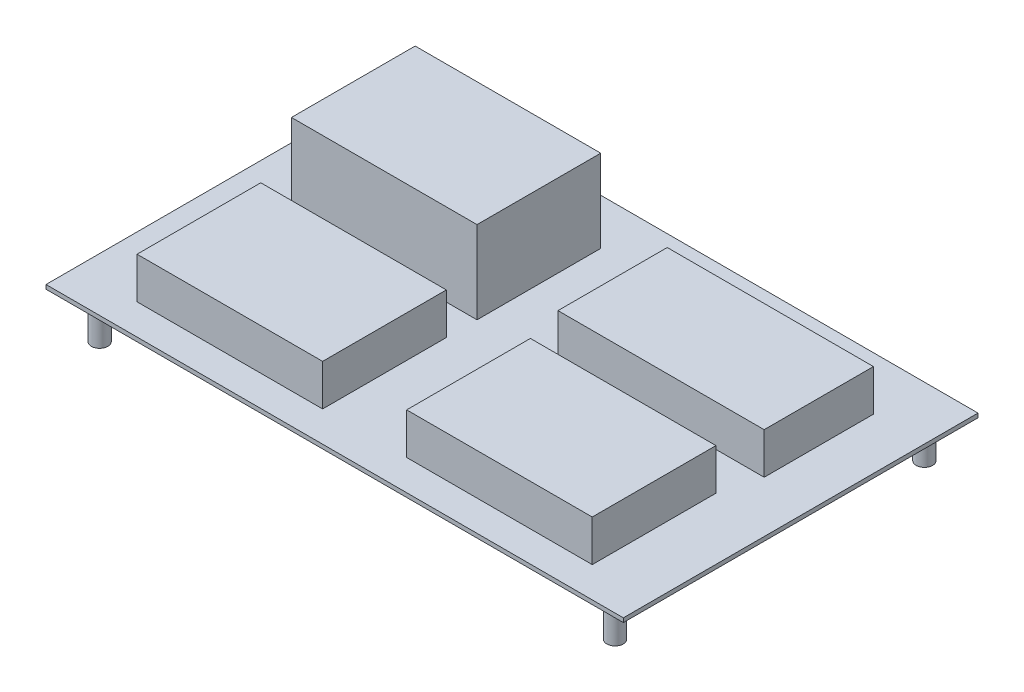
ISO-10303-21;
HEADER;
FILE_DESCRIPTION(('STEP AP214'),'2;1');
FILE_NAME('part.step','',(''),(''),'','','');
FILE_SCHEMA(('AUTOMOTIVE_DESIGN { 1 0 10303 214 1 1 1 1 }'));
ENDSEC;
DATA;
#1=APPLICATION_CONTEXT('core data for automotive mechanical design processes');
#2=APPLICATION_PROTOCOL_DEFINITION('international standard','automotive_design',2000,#1);
#3=PRODUCT_CONTEXT('',#1,'mechanical');
#4=PRODUCT('Part','Part','',(#3));
#5=PRODUCT_RELATED_PRODUCT_CATEGORY('part','',(#4));
#6=PRODUCT_DEFINITION_FORMATION('','',#4);
#7=PRODUCT_DEFINITION_CONTEXT('part definition',#1,'design');
#8=PRODUCT_DEFINITION('design','',#6,#7);
#9=PRODUCT_DEFINITION_SHAPE('','',#8);
#10=(LENGTH_UNIT() NAMED_UNIT(*) SI_UNIT(.MILLI.,.METRE.));
#11=(NAMED_UNIT(*) PLANE_ANGLE_UNIT() SI_UNIT($,.RADIAN.));
#12=(NAMED_UNIT(*) SI_UNIT($,.STERADIAN.) SOLID_ANGLE_UNIT());
#13=UNCERTAINTY_MEASURE_WITH_UNIT(LENGTH_MEASURE(1.E-05),#10,'distance_accuracy_value','');
#14=(GEOMETRIC_REPRESENTATION_CONTEXT(3) GLOBAL_UNCERTAINTY_ASSIGNED_CONTEXT((#13)) GLOBAL_UNIT_ASSIGNED_CONTEXT((#10,
#11,#12)) REPRESENTATION_CONTEXT('',''));
#15=CARTESIAN_POINT('',(0.,0.,0.));
#16=DIRECTION('',(0.,0.,1.));
#17=DIRECTION('',(1.,0.,0.));
#18=AXIS2_PLACEMENT_3D('',#15,#16,#17);
#19=CARTESIAN_POINT('',(0.,2.,0.));
#20=DIRECTION('',(0.,-1.,0.));
#21=DIRECTION('',(0.,0.,-1.));
#22=AXIS2_PLACEMENT_3D('',#19,#20,#21);
#23=PLANE('',#22);
#24=DIRECTION('',(0.,0.,-1.));
#25=VECTOR('',#24,1.);
#26=CARTESIAN_POINT('',(110.116180531911,2.,71.2018310445277));
#27=LINE('',#26,#25);
#28=CARTESIAN_POINT('',(110.116180531911,2.,71.2018310445277));
#29=VERTEX_POINT('',#28);
#30=CARTESIAN_POINT('',(110.116180531911,2.,11.2018310445277));
#31=VERTEX_POINT('',#30);
#32=EDGE_CURVE('E263',#29,#31,#27,.T.);
#33=ORIENTED_EDGE('',*,*,#32,.F.);
#34=DIRECTION('',(1.,0.,0.));
#35=VECTOR('',#34,1.);
#36=CARTESIAN_POINT('',(20.1161805319109,2.,71.2018310445277));
#37=LINE('',#36,#35);
#38=CARTESIAN_POINT('',(20.1161805319109,2.,71.2018310445277));
#39=VERTEX_POINT('',#38);
#40=EDGE_CURVE('E253',#39,#29,#37,.T.);
#41=ORIENTED_EDGE('',*,*,#40,.F.);
#42=DIRECTION('',(0.,0.,1.));
#43=VECTOR('',#42,1.);
#44=CARTESIAN_POINT('',(20.1161805319109,2.,71.2018310445277));
#45=LINE('',#44,#43);
#46=CARTESIAN_POINT('',(20.1161805319109,2.,11.2018310445277));
#47=VERTEX_POINT('',#46);
#48=EDGE_CURVE('E256',#47,#39,#45,.T.);
#49=ORIENTED_EDGE('',*,*,#48,.F.);
#50=DIRECTION('',(-1.,0.,0.));
#51=VECTOR('',#50,1.);
#52=CARTESIAN_POINT('',(20.1161805319109,2.,11.2018310445277));
#53=LINE('',#52,#51);
#54=EDGE_CURVE('E260',#31,#47,#53,.T.);
#55=ORIENTED_EDGE('',*,*,#54,.F.);
#56=EDGE_LOOP('',(#33,#41,#49,#55));
#57=FACE_BOUND('',#56,.T.);
#58=DIRECTION('',(0.,0.,-1.));
#59=VECTOR('',#58,1.);
#60=CARTESIAN_POINT('',(-20.6398819657247,2.,-3.67555706881552));
#61=LINE('',#60,#59);
#62=CARTESIAN_POINT('',(-20.6398819657247,2.,-3.67555706881552));
#63=VERTEX_POINT('',#62);
#64=CARTESIAN_POINT('',(-20.6398819657247,2.,-63.6755570688155));
#65=VERTEX_POINT('',#64);
#66=EDGE_CURVE('E299',#63,#65,#61,.T.);
#67=ORIENTED_EDGE('',*,*,#66,.F.);
#68=DIRECTION('',(1.,0.,0.));
#69=VECTOR('',#68,1.);
#70=CARTESIAN_POINT('',(-110.639881965725,2.,-3.67555706881552));
#71=LINE('',#70,#69);
#72=CARTESIAN_POINT('',(-110.639881965725,2.,-3.67555706881552));
#73=VERTEX_POINT('',#72);
#74=EDGE_CURVE('E313',#73,#63,#71,.T.);
#75=ORIENTED_EDGE('',*,*,#74,.F.);
#76=DIRECTION('',(0.,0.,1.));
#77=VECTOR('',#76,1.);
#78=CARTESIAN_POINT('',(-110.639881965725,2.,-3.67555706881552));
#79=LINE('',#78,#77);
#80=CARTESIAN_POINT('',(-110.639881965725,2.,-63.6755570688155));
#81=VERTEX_POINT('',#80);
#82=EDGE_CURVE('E184',#81,#73,#79,.T.);
#83=ORIENTED_EDGE('',*,*,#82,.F.);
#84=DIRECTION('',(-1.,0.,0.));
#85=VECTOR('',#84,1.);
#86=CARTESIAN_POINT('',(-110.639881965725,2.,-63.6755570688155));
#87=LINE('',#86,#85);
#88=EDGE_CURVE('E309',#65,#81,#87,.T.);
#89=ORIENTED_EDGE('',*,*,#88,.F.);
#90=EDGE_LOOP('',(#67,#75,#83,#89));
#91=FACE_BOUND('',#90,.T.);
#92=DIRECTION('',(0.,0.,-1.));
#93=VECTOR('',#92,1.);
#94=CARTESIAN_POINT('',(-140.,2.,86.));
#95=LINE('',#94,#93);
#96=CARTESIAN_POINT('',(-140.,2.,86.));
#97=VERTEX_POINT('',#96);
#98=CARTESIAN_POINT('',(-140.,2.,-86.));
#99=VERTEX_POINT('',#98);
#100=EDGE_CURVE('E321',#97,#99,#95,.T.);
#101=ORIENTED_EDGE('',*,*,#100,.F.);
#102=DIRECTION('',(1.,0.,0.));
#103=VECTOR('',#102,1.);
#104=CARTESIAN_POINT('',(-140.,2.,86.));
#105=LINE('',#104,#103);
#106=CARTESIAN_POINT('',(140.,2.,86.));
#107=VERTEX_POINT('',#106);
#108=EDGE_CURVE('E330',#97,#107,#105,.T.);
#109=ORIENTED_EDGE('',*,*,#108,.T.);
#110=DIRECTION('',(0.,0.,-1.));
#111=VECTOR('',#110,1.);
#112=CARTESIAN_POINT('',(140.,2.,86.));
#113=LINE('',#112,#111);
#114=CARTESIAN_POINT('',(140.,2.,-86.));
#115=VERTEX_POINT('',#114);
#116=EDGE_CURVE('E328',#107,#115,#113,.T.);
#117=ORIENTED_EDGE('',*,*,#116,.T.);
#118=DIRECTION('',(1.,0.,0.));
#119=VECTOR('',#118,1.);
#120=CARTESIAN_POINT('',(-140.,2.,-86.));
#121=LINE('',#120,#119);
#122=EDGE_CURVE('E324',#99,#115,#121,.T.);
#123=ORIENTED_EDGE('',*,*,#122,.F.);
#124=EDGE_LOOP('',(#101,#109,#117,#123));
#125=FACE_BOUND('',#124,.T.);
#126=DIRECTION('',(0.,0.,-1.));
#127=VECTOR('',#126,1.);
#128=CARTESIAN_POINT('',(-20.6398819657247,2.,71.2018310445277));
#129=LINE('',#128,#127);
#130=CARTESIAN_POINT('',(-20.6398819657247,2.,71.2018310445277));
#131=VERTEX_POINT('',#130);
#132=CARTESIAN_POINT('',(-20.6398819657247,2.,11.2018310445277));
#133=VERTEX_POINT('',#132);
#134=EDGE_CURVE('E296',#131,#133,#129,.T.);
#135=ORIENTED_EDGE('',*,*,#134,.F.);
#136=DIRECTION('',(1.,0.,0.));
#137=VECTOR('',#136,1.);
#138=CARTESIAN_POINT('',(-110.639881965725,2.,71.2018310445277));
#139=LINE('',#138,#137);
#140=CARTESIAN_POINT('',(-110.639881965725,2.,71.2018310445277));
#141=VERTEX_POINT('',#140);
#142=EDGE_CURVE('E286',#141,#131,#139,.T.);
#143=ORIENTED_EDGE('',*,*,#142,.F.);
#144=DIRECTION('',(0.,0.,1.));
#145=VECTOR('',#144,1.);
#146=CARTESIAN_POINT('',(-110.639881965725,2.,71.2018310445277));
#147=LINE('',#146,#145);
#148=CARTESIAN_POINT('',(-110.639881965725,2.,11.2018310445277));
#149=VERTEX_POINT('',#148);
#150=EDGE_CURVE('E289',#149,#141,#147,.T.);
#151=ORIENTED_EDGE('',*,*,#150,.F.);
#152=DIRECTION('',(-1.,0.,0.));
#153=VECTOR('',#152,1.);
#154=CARTESIAN_POINT('',(-110.639881965725,2.,11.2018310445277));
#155=LINE('',#154,#153);
#156=EDGE_CURVE('E293',#133,#149,#155,.T.);
#157=ORIENTED_EDGE('',*,*,#156,.F.);
#158=EDGE_LOOP('',(#135,#143,#151,#157));
#159=FACE_BOUND('',#158,.T.);
#160=DIRECTION('',(0.,0.,-1.));
#161=VECTOR('',#160,1.);
#162=CARTESIAN_POINT('',(115.116180531911,2.,-7.17555706881551));
#163=LINE('',#162,#161);
#164=CARTESIAN_POINT('',(115.116180531911,2.,-7.17555706881551));
#165=VERTEX_POINT('',#164);
#166=CARTESIAN_POINT('',(115.116180531911,2.,-60.1755570688155));
#167=VERTEX_POINT('',#166);
#168=EDGE_CURVE('E230',#165,#167,#163,.T.);
#169=ORIENTED_EDGE('',*,*,#168,.F.);
#170=DIRECTION('',(1.,0.,0.));
#171=VECTOR('',#170,1.);
#172=CARTESIAN_POINT('',(15.1161805319109,2.,-7.17555706881551));
#173=LINE('',#172,#171);
#174=CARTESIAN_POINT('',(15.1161805319109,2.,-7.17555706881551));
#175=VERTEX_POINT('',#174);
#176=EDGE_CURVE('E224',#175,#165,#173,.T.);
#177=ORIENTED_EDGE('',*,*,#176,.F.);
#178=DIRECTION('',(0.,0.,1.));
#179=VECTOR('',#178,1.);
#180=CARTESIAN_POINT('',(15.1161805319109,2.,-7.17555706881551));
#181=LINE('',#180,#179);
#182=CARTESIAN_POINT('',(15.1161805319109,2.,-60.1755570688155));
#183=VERTEX_POINT('',#182);
#184=EDGE_CURVE('E63',#183,#175,#181,.T.);
#185=ORIENTED_EDGE('',*,*,#184,.F.);
#186=DIRECTION('',(-1.,0.,0.));
#187=VECTOR('',#186,1.);
#188=CARTESIAN_POINT('',(15.1161805319109,2.,-60.1755570688155));
#189=LINE('',#188,#187);
#190=EDGE_CURVE('E58',#167,#183,#189,.T.);
#191=ORIENTED_EDGE('',*,*,#190,.F.);
#192=EDGE_LOOP('',(#169,#177,#185,#191));
#193=FACE_BOUND('',#192,.T.);
#194=ADVANCED_FACE('F41',(#57,#91,#125,#159,#193),#23,.F.);
#195=CARTESIAN_POINT('',(-140.,2.,86.));
#196=DIRECTION('',(-1.,0.,0.));
#197=DIRECTION('',(0.,0.,1.));
#198=AXIS2_PLACEMENT_3D('',#195,#196,#197);
#199=PLANE('',#198);
#200=DIRECTION('',(0.,0.,-1.));
#201=VECTOR('',#200,1.);
#202=CARTESIAN_POINT('',(-140.,0.,86.));
#203=LINE('',#202,#201);
#204=CARTESIAN_POINT('',(-140.,0.,86.));
#205=VERTEX_POINT('',#204);
#206=CARTESIAN_POINT('',(-140.,0.,-86.));
#207=VERTEX_POINT('',#206);
#208=EDGE_CURVE('E320',#205,#207,#203,.T.);
#209=ORIENTED_EDGE('',*,*,#208,.F.);
#210=DIRECTION('',(0.,-1.,0.));
#211=VECTOR('',#210,1.);
#212=CARTESIAN_POINT('',(-140.,2.,86.));
#213=LINE('',#212,#211);
#214=EDGE_CURVE('E11',#97,#205,#213,.T.);
#215=ORIENTED_EDGE('',*,*,#214,.F.);
#216=ORIENTED_EDGE('',*,*,#100,.T.);
#217=DIRECTION('',(0.,-1.,0.));
#218=VECTOR('',#217,1.);
#219=CARTESIAN_POINT('',(-140.,2.,-86.));
#220=LINE('',#219,#218);
#221=EDGE_CURVE('E45',#99,#207,#220,.T.);
#222=ORIENTED_EDGE('',*,*,#221,.T.);
#223=EDGE_LOOP('',(#209,#215,#216,#222));
#224=FACE_BOUND('',#223,.T.);
#225=ADVANCED_FACE('F43',(#224),#199,.T.);
#226=CARTESIAN_POINT('',(-140.,2.,86.));
#227=DIRECTION('',(0.,0.,-1.));
#228=DIRECTION('',(-1.,0.,0.));
#229=AXIS2_PLACEMENT_3D('',#226,#227,#228);
#230=PLANE('',#229);
#231=DIRECTION('',(1.,0.,0.));
#232=VECTOR('',#231,1.);
#233=CARTESIAN_POINT('',(-140.,0.,86.));
#234=LINE('',#233,#232);
#235=CARTESIAN_POINT('',(140.,0.,86.));
#236=VERTEX_POINT('',#235);
#237=EDGE_CURVE('E325',#205,#236,#234,.T.);
#238=ORIENTED_EDGE('',*,*,#237,.T.);
#239=DIRECTION('',(0.,-1.,0.));
#240=VECTOR('',#239,1.);
#241=CARTESIAN_POINT('',(140.,2.,86.));
#242=LINE('',#241,#240);
#243=EDGE_CURVE('E50',#107,#236,#242,.T.);
#244=ORIENTED_EDGE('',*,*,#243,.F.);
#245=ORIENTED_EDGE('',*,*,#108,.F.);
#246=ORIENTED_EDGE('',*,*,#214,.T.);
#247=EDGE_LOOP('',(#238,#244,#245,#246));
#248=FACE_BOUND('',#247,.T.);
#249=ADVANCED_FACE('F357',(#248),#230,.F.);
#250=CARTESIAN_POINT('',(140.,2.,86.));
#251=DIRECTION('',(-1.,0.,0.));
#252=DIRECTION('',(0.,0.,1.));
#253=AXIS2_PLACEMENT_3D('',#250,#251,#252);
#254=PLANE('',#253);
#255=DIRECTION('',(0.,0.,-1.));
#256=VECTOR('',#255,1.);
#257=CARTESIAN_POINT('',(140.,0.,86.));
#258=LINE('',#257,#256);
#259=CARTESIAN_POINT('',(140.,0.,-86.));
#260=VERTEX_POINT('',#259);
#261=EDGE_CURVE('E337',#236,#260,#258,.T.);
#262=ORIENTED_EDGE('',*,*,#261,.T.);
#263=DIRECTION('',(0.,-1.,0.));
#264=VECTOR('',#263,1.);
#265=CARTESIAN_POINT('',(140.,2.,-86.));
#266=LINE('',#265,#264);
#267=EDGE_CURVE('E342',#115,#260,#266,.T.);
#268=ORIENTED_EDGE('',*,*,#267,.F.);
#269=ORIENTED_EDGE('',*,*,#116,.F.);
#270=ORIENTED_EDGE('',*,*,#243,.T.);
#271=EDGE_LOOP('',(#262,#268,#269,#270));
#272=FACE_BOUND('',#271,.T.);
#273=ADVANCED_FACE('F361',(#272),#254,.F.);
#274=CARTESIAN_POINT('',(-140.,2.,-86.));
#275=DIRECTION('',(0.,0.,-1.));
#276=DIRECTION('',(-1.,0.,0.));
#277=AXIS2_PLACEMENT_3D('',#274,#275,#276);
#278=PLANE('',#277);
#279=DIRECTION('',(1.,0.,0.));
#280=VECTOR('',#279,1.);
#281=CARTESIAN_POINT('',(-140.,0.,-86.));
#282=LINE('',#281,#280);
#283=EDGE_CURVE('E334',#207,#260,#282,.T.);
#284=ORIENTED_EDGE('',*,*,#283,.F.);
#285=ORIENTED_EDGE('',*,*,#221,.F.);
#286=ORIENTED_EDGE('',*,*,#122,.T.);
#287=ORIENTED_EDGE('',*,*,#267,.T.);
#288=EDGE_LOOP('',(#284,#285,#286,#287));
#289=FACE_BOUND('',#288,.T.);
#290=ADVANCED_FACE('F350',(#289),#278,.T.);
#291=CARTESIAN_POINT('',(0.,0.,0.));
#292=DIRECTION('',(0.,-1.,0.));
#293=DIRECTION('',(0.,0.,-1.));
#294=AXIS2_PLACEMENT_3D('',#291,#292,#293);
#295=PLANE('',#294);
#296=CARTESIAN_POINT('',(-124.999999999998,0.,-75.));
#297=DIRECTION('',(0.,-1.,0.));
#298=DIRECTION('',(0.,0.,-1.));
#299=AXIS2_PLACEMENT_3D('',#296,#297,#298);
#300=CIRCLE('',#299,4.00000000000001);
#301=CARTESIAN_POINT('',(-124.999999999998,0.,-79.));
#302=VERTEX_POINT('',#301);
#303=EDGE_CURVE('E778',#302,#302,#300,.T.);
#304=ORIENTED_EDGE('',*,*,#303,.F.);
#305=EDGE_LOOP('',(#304));
#306=FACE_BOUND('',#305,.T.);
#307=CARTESIAN_POINT('',(125.000000000002,0.,-75.));
#308=DIRECTION('',(0.,-1.,0.));
#309=DIRECTION('',(0.,0.,-1.));
#310=AXIS2_PLACEMENT_3D('',#307,#308,#309);
#311=CIRCLE('',#310,3.99999999999999);
#312=CARTESIAN_POINT('',(125.000000000002,0.,-79.));
#313=VERTEX_POINT('',#312);
#314=EDGE_CURVE('E784',#313,#313,#311,.T.);
#315=ORIENTED_EDGE('',*,*,#314,.F.);
#316=EDGE_LOOP('',(#315));
#317=FACE_BOUND('',#316,.T.);
#318=CARTESIAN_POINT('',(125.,0.,75.));
#319=DIRECTION('',(0.,-1.,0.));
#320=DIRECTION('',(0.,0.,-1.));
#321=AXIS2_PLACEMENT_3D('',#318,#319,#320);
#322=CIRCLE('',#321,3.99999999999999);
#323=CARTESIAN_POINT('',(125.,0.,71.));
#324=VERTEX_POINT('',#323);
#325=EDGE_CURVE('E790',#324,#324,#322,.T.);
#326=ORIENTED_EDGE('',*,*,#325,.F.);
#327=EDGE_LOOP('',(#326));
#328=FACE_BOUND('',#327,.T.);
#329=CARTESIAN_POINT('',(-125.,0.,75.));
#330=DIRECTION('',(0.,-1.,0.));
#331=DIRECTION('',(0.,0.,-1.));
#332=AXIS2_PLACEMENT_3D('',#329,#330,#331);
#333=CIRCLE('',#332,4.00000000000001);
#334=CARTESIAN_POINT('',(-125.,0.,71.));
#335=VERTEX_POINT('',#334);
#336=EDGE_CURVE('E206',#335,#335,#333,.T.);
#337=ORIENTED_EDGE('',*,*,#336,.F.);
#338=EDGE_LOOP('',(#337));
#339=FACE_BOUND('',#338,.T.);
#340=ORIENTED_EDGE('',*,*,#208,.T.);
#341=ORIENTED_EDGE('',*,*,#283,.T.);
#342=ORIENTED_EDGE('',*,*,#261,.F.);
#343=ORIENTED_EDGE('',*,*,#237,.F.);
#344=EDGE_LOOP('',(#340,#341,#342,#343));
#345=FACE_BOUND('',#344,.T.);
#346=ADVANCED_FACE('F354',(#306,#317,#328,#339,#345),#295,.T.);
#347=CARTESIAN_POINT('',(-20.6398819657247,22.,-3.67555706881552));
#348=DIRECTION('',(-1.,0.,0.));
#349=DIRECTION('',(0.,0.,1.));
#350=AXIS2_PLACEMENT_3D('',#347,#348,#349);
#351=PLANE('',#350);
#352=ORIENTED_EDGE('',*,*,#66,.T.);
#353=DIRECTION('',(0.,-1.,0.));
#354=VECTOR('',#353,1.);
#355=CARTESIAN_POINT('',(-20.6398819657247,22.,-63.6755570688155));
#356=LINE('',#355,#354);
#357=CARTESIAN_POINT('',(-20.6398819657247,42.,-63.6755570688155));
#358=VERTEX_POINT('',#357);
#359=EDGE_CURVE('E317',#358,#65,#356,.T.);
#360=ORIENTED_EDGE('',*,*,#359,.F.);
#361=DIRECTION('',(0.,0.,-1.));
#362=VECTOR('',#361,1.);
#363=CARTESIAN_POINT('',(-20.6398819657247,42.,-63.6755570688155));
#364=LINE('',#363,#362);
#365=CARTESIAN_POINT('',(-20.6398819657247,42.,-3.67555706881552));
#366=VERTEX_POINT('',#365);
#367=EDGE_CURVE('E197',#366,#358,#364,.T.);
#368=ORIENTED_EDGE('',*,*,#367,.F.);
#369=DIRECTION('',(0.,-1.,0.));
#370=VECTOR('',#369,1.);
#371=CARTESIAN_POINT('',(-20.6398819657247,22.,-3.67555706881552));
#372=LINE('',#371,#370);
#373=EDGE_CURVE('E188',#366,#63,#372,.T.);
#374=ORIENTED_EDGE('',*,*,#373,.T.);
#375=EDGE_LOOP('',(#352,#360,#368,#374));
#376=FACE_BOUND('',#375,.T.);
#377=ADVANCED_FACE('F445',(#376),#351,.F.);
#378=CARTESIAN_POINT('',(-110.639881965725,22.,-63.6755570688155));
#379=DIRECTION('',(0.,0.,1.));
#380=DIRECTION('',(1.,0.,0.));
#381=AXIS2_PLACEMENT_3D('',#378,#379,#380);
#382=PLANE('',#381);
#383=ORIENTED_EDGE('',*,*,#88,.T.);
#384=DIRECTION('',(0.,-1.,0.));
#385=VECTOR('',#384,1.);
#386=CARTESIAN_POINT('',(-110.639881965725,22.,-63.6755570688155));
#387=LINE('',#386,#385);
#388=CARTESIAN_POINT('',(-110.639881965725,42.,-63.6755570688155));
#389=VERTEX_POINT('',#388);
#390=EDGE_CURVE('E187',#389,#81,#387,.T.);
#391=ORIENTED_EDGE('',*,*,#390,.F.);
#392=DIRECTION('',(-1.,0.,0.));
#393=VECTOR('',#392,1.);
#394=CARTESIAN_POINT('',(-110.639881965725,42.,-63.6755570688155));
#395=LINE('',#394,#393);
#396=EDGE_CURVE('E202',#358,#389,#395,.T.);
#397=ORIENTED_EDGE('',*,*,#396,.F.);
#398=ORIENTED_EDGE('',*,*,#359,.T.);
#399=EDGE_LOOP('',(#383,#391,#397,#398));
#400=FACE_BOUND('',#399,.T.);
#401=ADVANCED_FACE('F442',(#400),#382,.F.);
#402=CARTESIAN_POINT('',(-110.639881965725,22.,-3.67555706881552));
#403=DIRECTION('',(1.,0.,0.));
#404=DIRECTION('',(0.,0.,-1.));
#405=AXIS2_PLACEMENT_3D('',#402,#403,#404);
#406=PLANE('',#405);
#407=ORIENTED_EDGE('',*,*,#82,.T.);
#408=DIRECTION('',(0.,-1.,0.));
#409=VECTOR('',#408,1.);
#410=CARTESIAN_POINT('',(-110.639881965725,22.,-3.67555706881552));
#411=LINE('',#410,#409);
#412=CARTESIAN_POINT('',(-110.639881965725,42.,-3.67555706881552));
#413=VERTEX_POINT('',#412);
#414=EDGE_CURVE('E178',#413,#73,#411,.T.);
#415=ORIENTED_EDGE('',*,*,#414,.F.);
#416=DIRECTION('',(0.,0.,1.));
#417=VECTOR('',#416,1.);
#418=CARTESIAN_POINT('',(-110.639881965725,42.,-63.6755570688155));
#419=LINE('',#418,#417);
#420=EDGE_CURVE('E183',#389,#413,#419,.T.);
#421=ORIENTED_EDGE('',*,*,#420,.F.);
#422=ORIENTED_EDGE('',*,*,#390,.T.);
#423=EDGE_LOOP('',(#407,#415,#421,#422));
#424=FACE_BOUND('',#423,.T.);
#425=ADVANCED_FACE('F180',(#424),#406,.F.);
#426=CARTESIAN_POINT('',(-110.639881965725,22.,-3.67555706881552));
#427=DIRECTION('',(0.,0.,-1.));
#428=DIRECTION('',(-1.,0.,0.));
#429=AXIS2_PLACEMENT_3D('',#426,#427,#428);
#430=PLANE('',#429);
#431=ORIENTED_EDGE('',*,*,#74,.T.);
#432=ORIENTED_EDGE('',*,*,#373,.F.);
#433=DIRECTION('',(1.,0.,0.));
#434=VECTOR('',#433,1.);
#435=CARTESIAN_POINT('',(-110.639881965725,42.,-3.67555706881552));
#436=LINE('',#435,#434);
#437=EDGE_CURVE('E191',#413,#366,#436,.T.);
#438=ORIENTED_EDGE('',*,*,#437,.F.);
#439=ORIENTED_EDGE('',*,*,#414,.T.);
#440=EDGE_LOOP('',(#431,#432,#438,#439));
#441=FACE_BOUND('',#440,.T.);
#442=ADVANCED_FACE('F192',(#441),#430,.F.);
#443=CARTESIAN_POINT('',(-20.6398819657247,22.,71.2018310445277));
#444=DIRECTION('',(-1.,0.,0.));
#445=DIRECTION('',(0.,0.,1.));
#446=AXIS2_PLACEMENT_3D('',#443,#444,#445);
#447=PLANE('',#446);
#448=ORIENTED_EDGE('',*,*,#134,.T.);
#449=DIRECTION('',(0.,-1.,0.));
#450=VECTOR('',#449,1.);
#451=CARTESIAN_POINT('',(-20.6398819657247,22.,11.2018310445277));
#452=LINE('',#451,#450);
#453=CARTESIAN_POINT('',(-20.6398819657247,22.,11.2018310445277));
#454=VERTEX_POINT('',#453);
#455=EDGE_CURVE('E266',#454,#133,#452,.T.);
#456=ORIENTED_EDGE('',*,*,#455,.F.);
#457=DIRECTION('',(0.,0.,-1.));
#458=VECTOR('',#457,1.);
#459=CARTESIAN_POINT('',(-20.6398819657247,22.,71.2018310445277));
#460=LINE('',#459,#458);
#461=CARTESIAN_POINT('',(-20.6398819657247,22.,71.2018310445277));
#462=VERTEX_POINT('',#461);
#463=EDGE_CURVE('E290',#462,#454,#460,.T.);
#464=ORIENTED_EDGE('',*,*,#463,.F.);
#465=DIRECTION('',(0.,-1.,0.));
#466=VECTOR('',#465,1.);
#467=CARTESIAN_POINT('',(-20.6398819657247,22.,71.2018310445277));
#468=LINE('',#467,#466);
#469=EDGE_CURVE('E282',#462,#131,#468,.T.);
#470=ORIENTED_EDGE('',*,*,#469,.T.);
#471=EDGE_LOOP('',(#448,#456,#464,#470));
#472=FACE_BOUND('',#471,.T.);
#473=ADVANCED_FACE('F419',(#472),#447,.F.);
#474=CARTESIAN_POINT('',(-110.639881965725,22.,11.2018310445277));
#475=DIRECTION('',(0.,0.,1.));
#476=DIRECTION('',(1.,0.,0.));
#477=AXIS2_PLACEMENT_3D('',#474,#475,#476);
#478=PLANE('',#477);
#479=ORIENTED_EDGE('',*,*,#156,.T.);
#480=DIRECTION('',(0.,-1.,0.));
#481=VECTOR('',#480,1.);
#482=CARTESIAN_POINT('',(-110.639881965725,22.,11.2018310445277));
#483=LINE('',#482,#481);
#484=CARTESIAN_POINT('',(-110.639881965725,22.,11.2018310445277));
#485=VERTEX_POINT('',#484);
#486=EDGE_CURVE('E276',#485,#149,#483,.T.);
#487=ORIENTED_EDGE('',*,*,#486,.F.);
#488=DIRECTION('',(-1.,0.,0.));
#489=VECTOR('',#488,1.);
#490=CARTESIAN_POINT('',(-110.639881965725,22.,11.2018310445277));
#491=LINE('',#490,#489);
#492=EDGE_CURVE('E303',#454,#485,#491,.T.);
#493=ORIENTED_EDGE('',*,*,#492,.F.);
#494=ORIENTED_EDGE('',*,*,#455,.T.);
#495=EDGE_LOOP('',(#479,#487,#493,#494));
#496=FACE_BOUND('',#495,.T.);
#497=ADVANCED_FACE('F422',(#496),#478,.F.);
#498=CARTESIAN_POINT('',(-110.639881965725,22.,71.2018310445277));
#499=DIRECTION('',(1.,0.,0.));
#500=DIRECTION('',(0.,0.,-1.));
#501=AXIS2_PLACEMENT_3D('',#498,#499,#500);
#502=PLANE('',#501);
#503=ORIENTED_EDGE('',*,*,#150,.T.);
#504=DIRECTION('',(0.,-1.,0.));
#505=VECTOR('',#504,1.);
#506=CARTESIAN_POINT('',(-110.639881965725,22.,71.2018310445277));
#507=LINE('',#506,#505);
#508=CARTESIAN_POINT('',(-110.639881965725,22.,71.2018310445277));
#509=VERTEX_POINT('',#508);
#510=EDGE_CURVE('E279',#509,#141,#507,.T.);
#511=ORIENTED_EDGE('',*,*,#510,.F.);
#512=DIRECTION('',(0.,0.,1.));
#513=VECTOR('',#512,1.);
#514=CARTESIAN_POINT('',(-110.639881965725,22.,71.2018310445277));
#515=LINE('',#514,#513);
#516=EDGE_CURVE('E301',#485,#509,#515,.T.);
#517=ORIENTED_EDGE('',*,*,#516,.F.);
#518=ORIENTED_EDGE('',*,*,#486,.T.);
#519=EDGE_LOOP('',(#503,#511,#517,#518));
#520=FACE_BOUND('',#519,.T.);
#521=ADVANCED_FACE('F426',(#520),#502,.F.);
#522=CARTESIAN_POINT('',(-110.639881965725,22.,71.2018310445277));
#523=DIRECTION('',(0.,0.,-1.));
#524=DIRECTION('',(-1.,0.,0.));
#525=AXIS2_PLACEMENT_3D('',#522,#523,#524);
#526=PLANE('',#525);
#527=ORIENTED_EDGE('',*,*,#142,.T.);
#528=ORIENTED_EDGE('',*,*,#469,.F.);
#529=DIRECTION('',(1.,0.,0.));
#530=VECTOR('',#529,1.);
#531=CARTESIAN_POINT('',(-110.639881965725,22.,71.2018310445277));
#532=LINE('',#531,#530);
#533=EDGE_CURVE('E285',#509,#462,#532,.T.);
#534=ORIENTED_EDGE('',*,*,#533,.F.);
#535=ORIENTED_EDGE('',*,*,#510,.T.);
#536=EDGE_LOOP('',(#527,#528,#534,#535));
#537=FACE_BOUND('',#536,.T.);
#538=ADVANCED_FACE('F430',(#537),#526,.F.);
#539=CARTESIAN_POINT('',(0.,22.,0.));
#540=DIRECTION('',(0.,-1.,0.));
#541=DIRECTION('',(0.,0.,-1.));
#542=AXIS2_PLACEMENT_3D('',#539,#540,#541);
#543=PLANE('',#542);
#544=ORIENTED_EDGE('',*,*,#463,.T.);
#545=ORIENTED_EDGE('',*,*,#492,.T.);
#546=ORIENTED_EDGE('',*,*,#516,.T.);
#547=ORIENTED_EDGE('',*,*,#533,.T.);
#548=EDGE_LOOP('',(#544,#545,#546,#547));
#549=FACE_BOUND('',#548,.T.);
#550=ADVANCED_FACE('F403',(#549),#543,.F.);
#551=CARTESIAN_POINT('',(110.116180531911,22.,71.2018310445277));
#552=DIRECTION('',(-1.,0.,0.));
#553=DIRECTION('',(0.,0.,1.));
#554=AXIS2_PLACEMENT_3D('',#551,#552,#553);
#555=PLANE('',#554);
#556=ORIENTED_EDGE('',*,*,#32,.T.);
#557=DIRECTION('',(0.,-1.,0.));
#558=VECTOR('',#557,1.);
#559=CARTESIAN_POINT('',(110.116180531911,22.,11.2018310445277));
#560=LINE('',#559,#558);
#561=CARTESIAN_POINT('',(110.116180531911,22.,11.2018310445277));
#562=VERTEX_POINT('',#561);
#563=EDGE_CURVE('E233',#562,#31,#560,.T.);
#564=ORIENTED_EDGE('',*,*,#563,.F.);
#565=DIRECTION('',(0.,0.,-1.));
#566=VECTOR('',#565,1.);
#567=CARTESIAN_POINT('',(110.116180531911,22.,71.2018310445277));
#568=LINE('',#567,#566);
#569=CARTESIAN_POINT('',(110.116180531911,22.,71.2018310445277));
#570=VERTEX_POINT('',#569);
#571=EDGE_CURVE('E257',#570,#562,#568,.T.);
#572=ORIENTED_EDGE('',*,*,#571,.F.);
#573=DIRECTION('',(0.,-1.,0.));
#574=VECTOR('',#573,1.);
#575=CARTESIAN_POINT('',(110.116180531911,22.,71.2018310445277));
#576=LINE('',#575,#574);
#577=EDGE_CURVE('E249',#570,#29,#576,.T.);
#578=ORIENTED_EDGE('',*,*,#577,.T.);
#579=EDGE_LOOP('',(#556,#564,#572,#578));
#580=FACE_BOUND('',#579,.T.);
#581=ADVANCED_FACE('F399',(#580),#555,.F.);
#582=CARTESIAN_POINT('',(20.1161805319109,22.,11.2018310445277));
#583=DIRECTION('',(0.,0.,1.));
#584=DIRECTION('',(1.,0.,0.));
#585=AXIS2_PLACEMENT_3D('',#582,#583,#584);
#586=PLANE('',#585);
#587=ORIENTED_EDGE('',*,*,#54,.T.);
#588=DIRECTION('',(0.,-1.,0.));
#589=VECTOR('',#588,1.);
#590=CARTESIAN_POINT('',(20.1161805319109,22.,11.2018310445277));
#591=LINE('',#590,#589);
#592=CARTESIAN_POINT('',(20.1161805319109,22.,11.2018310445277));
#593=VERTEX_POINT('',#592);
#594=EDGE_CURVE('E243',#593,#47,#591,.T.);
#595=ORIENTED_EDGE('',*,*,#594,.F.);
#596=DIRECTION('',(-1.,0.,0.));
#597=VECTOR('',#596,1.);
#598=CARTESIAN_POINT('',(20.1161805319109,22.,11.2018310445277));
#599=LINE('',#598,#597);
#600=EDGE_CURVE('E270',#562,#593,#599,.T.);
#601=ORIENTED_EDGE('',*,*,#600,.F.);
#602=ORIENTED_EDGE('',*,*,#563,.T.);
#603=EDGE_LOOP('',(#587,#595,#601,#602));
#604=FACE_BOUND('',#603,.T.);
#605=ADVANCED_FACE('F402',(#604),#586,.F.);
#606=CARTESIAN_POINT('',(20.1161805319109,22.,71.2018310445277));
#607=DIRECTION('',(1.,0.,0.));
#608=DIRECTION('',(0.,0.,-1.));
#609=AXIS2_PLACEMENT_3D('',#606,#607,#608);
#610=PLANE('',#609);
#611=ORIENTED_EDGE('',*,*,#48,.T.);
#612=DIRECTION('',(0.,-1.,0.));
#613=VECTOR('',#612,1.);
#614=CARTESIAN_POINT('',(20.1161805319109,22.,71.2018310445277));
#615=LINE('',#614,#613);
#616=CARTESIAN_POINT('',(20.1161805319109,22.,71.2018310445277));
#617=VERTEX_POINT('',#616);
#618=EDGE_CURVE('E246',#617,#39,#615,.T.);
#619=ORIENTED_EDGE('',*,*,#618,.F.);
#620=DIRECTION('',(0.,0.,1.));
#621=VECTOR('',#620,1.);
#622=CARTESIAN_POINT('',(20.1161805319109,22.,71.2018310445277));
#623=LINE('',#622,#621);
#624=EDGE_CURVE('E268',#593,#617,#623,.T.);
#625=ORIENTED_EDGE('',*,*,#624,.F.);
#626=ORIENTED_EDGE('',*,*,#594,.T.);
#627=EDGE_LOOP('',(#611,#619,#625,#626));
#628=FACE_BOUND('',#627,.T.);
#629=ADVANCED_FACE('F407',(#628),#610,.F.);
#630=CARTESIAN_POINT('',(20.1161805319109,22.,71.2018310445277));
#631=DIRECTION('',(0.,0.,-1.));
#632=DIRECTION('',(-1.,0.,0.));
#633=AXIS2_PLACEMENT_3D('',#630,#631,#632);
#634=PLANE('',#633);
#635=ORIENTED_EDGE('',*,*,#40,.T.);
#636=ORIENTED_EDGE('',*,*,#577,.F.);
#637=DIRECTION('',(1.,0.,0.));
#638=VECTOR('',#637,1.);
#639=CARTESIAN_POINT('',(20.1161805319109,22.,71.2018310445277));
#640=LINE('',#639,#638);
#641=EDGE_CURVE('E252',#617,#570,#640,.T.);
#642=ORIENTED_EDGE('',*,*,#641,.F.);
#643=ORIENTED_EDGE('',*,*,#618,.T.);
#644=EDGE_LOOP('',(#635,#636,#642,#643));
#645=FACE_BOUND('',#644,.T.);
#646=ADVANCED_FACE('F411',(#645),#634,.F.);
#647=CARTESIAN_POINT('',(0.,22.,0.));
#648=DIRECTION('',(0.,-1.,0.));
#649=DIRECTION('',(0.,0.,-1.));
#650=AXIS2_PLACEMENT_3D('',#647,#648,#649);
#651=PLANE('',#650);
#652=ORIENTED_EDGE('',*,*,#571,.T.);
#653=ORIENTED_EDGE('',*,*,#600,.T.);
#654=ORIENTED_EDGE('',*,*,#624,.T.);
#655=ORIENTED_EDGE('',*,*,#641,.T.);
#656=EDGE_LOOP('',(#652,#653,#654,#655));
#657=FACE_BOUND('',#656,.T.);
#658=ADVANCED_FACE('F391',(#657),#651,.F.);
#659=CARTESIAN_POINT('',(115.116180531911,22.,-7.17555706881551));
#660=DIRECTION('',(-1.,0.,0.));
#661=DIRECTION('',(0.,0.,1.));
#662=AXIS2_PLACEMENT_3D('',#659,#660,#661);
#663=PLANE('',#662);
#664=ORIENTED_EDGE('',*,*,#168,.T.);
#665=DIRECTION('',(0.,-1.,0.));
#666=VECTOR('',#665,1.);
#667=CARTESIAN_POINT('',(115.116180531911,22.,-60.1755570688155));
#668=LINE('',#667,#666);
#669=CARTESIAN_POINT('',(115.116180531911,22.,-60.1755570688155));
#670=VERTEX_POINT('',#669);
#671=EDGE_CURVE('E212',#670,#167,#668,.T.);
#672=ORIENTED_EDGE('',*,*,#671,.F.);
#673=DIRECTION('',(0.,0.,-1.));
#674=VECTOR('',#673,1.);
#675=CARTESIAN_POINT('',(115.116180531911,22.,-7.17555706881551));
#676=LINE('',#675,#674);
#677=CARTESIAN_POINT('',(115.116180531911,22.,-7.17555706881551));
#678=VERTEX_POINT('',#677);
#679=EDGE_CURVE('E227',#678,#670,#676,.T.);
#680=ORIENTED_EDGE('',*,*,#679,.F.);
#681=DIRECTION('',(0.,-1.,0.));
#682=VECTOR('',#681,1.);
#683=CARTESIAN_POINT('',(115.116180531911,22.,-7.17555706881551));
#684=LINE('',#683,#682);
#685=EDGE_CURVE('E220',#678,#165,#684,.T.);
#686=ORIENTED_EDGE('',*,*,#685,.T.);
#687=EDGE_LOOP('',(#664,#672,#680,#686));
#688=FACE_BOUND('',#687,.T.);
#689=ADVANCED_FACE('F375',(#688),#663,.F.);
#690=CARTESIAN_POINT('',(15.1161805319109,22.,-60.1755570688155));
#691=DIRECTION('',(0.,0.,1.));
#692=DIRECTION('',(1.,0.,0.));
#693=AXIS2_PLACEMENT_3D('',#690,#691,#692);
#694=PLANE('',#693);
#695=ORIENTED_EDGE('',*,*,#190,.T.);
#696=DIRECTION('',(0.,-1.,0.));
#697=VECTOR('',#696,1.);
#698=CARTESIAN_POINT('',(15.1161805319109,22.,-60.1755570688155));
#699=LINE('',#698,#697);
#700=CARTESIAN_POINT('',(15.1161805319109,22.,-60.1755570688155));
#701=VERTEX_POINT('',#700);
#702=EDGE_CURVE('E214',#701,#183,#699,.T.);
#703=ORIENTED_EDGE('',*,*,#702,.F.);
#704=DIRECTION('',(-1.,0.,0.));
#705=VECTOR('',#704,1.);
#706=CARTESIAN_POINT('',(15.1161805319109,22.,-60.1755570688155));
#707=LINE('',#706,#705);
#708=EDGE_CURVE('E237',#670,#701,#707,.T.);
#709=ORIENTED_EDGE('',*,*,#708,.F.);
#710=ORIENTED_EDGE('',*,*,#671,.T.);
#711=EDGE_LOOP('',(#695,#703,#709,#710));
#712=FACE_BOUND('',#711,.T.);
#713=ADVANCED_FACE('F383',(#712),#694,.F.);
#714=CARTESIAN_POINT('',(15.1161805319109,22.,-7.17555706881551));
#715=DIRECTION('',(1.,0.,0.));
#716=DIRECTION('',(0.,0.,-1.));
#717=AXIS2_PLACEMENT_3D('',#714,#715,#716);
#718=PLANE('',#717);
#719=ORIENTED_EDGE('',*,*,#184,.T.);
#720=DIRECTION('',(0.,-1.,0.));
#721=VECTOR('',#720,1.);
#722=CARTESIAN_POINT('',(15.1161805319109,22.,-7.17555706881551));
#723=LINE('',#722,#721);
#724=CARTESIAN_POINT('',(15.1161805319109,22.,-7.17555706881551));
#725=VERTEX_POINT('',#724);
#726=EDGE_CURVE('E217',#725,#175,#723,.T.);
#727=ORIENTED_EDGE('',*,*,#726,.F.);
#728=DIRECTION('',(0.,0.,1.));
#729=VECTOR('',#728,1.);
#730=CARTESIAN_POINT('',(15.1161805319109,22.,-7.17555706881551));
#731=LINE('',#730,#729);
#732=EDGE_CURVE('E235',#701,#725,#731,.T.);
#733=ORIENTED_EDGE('',*,*,#732,.F.);
#734=ORIENTED_EDGE('',*,*,#702,.T.);
#735=EDGE_LOOP('',(#719,#727,#733,#734));
#736=FACE_BOUND('',#735,.T.);
#737=ADVANCED_FACE('F381',(#736),#718,.F.);
#738=CARTESIAN_POINT('',(15.1161805319109,22.,-7.17555706881551));
#739=DIRECTION('',(0.,0.,-1.));
#740=DIRECTION('',(-1.,0.,0.));
#741=AXIS2_PLACEMENT_3D('',#738,#739,#740);
#742=PLANE('',#741);
#743=ORIENTED_EDGE('',*,*,#176,.T.);
#744=ORIENTED_EDGE('',*,*,#685,.F.);
#745=DIRECTION('',(1.,0.,0.));
#746=VECTOR('',#745,1.);
#747=CARTESIAN_POINT('',(15.1161805319109,22.,-7.17555706881551));
#748=LINE('',#747,#746);
#749=EDGE_CURVE('E223',#725,#678,#748,.T.);
#750=ORIENTED_EDGE('',*,*,#749,.F.);
#751=ORIENTED_EDGE('',*,*,#726,.T.);
#752=EDGE_LOOP('',(#743,#744,#750,#751));
#753=FACE_BOUND('',#752,.T.);
#754=ADVANCED_FACE('F371',(#753),#742,.F.);
#755=CARTESIAN_POINT('',(0.,22.,0.));
#756=DIRECTION('',(0.,-1.,0.));
#757=DIRECTION('',(0.,0.,-1.));
#758=AXIS2_PLACEMENT_3D('',#755,#756,#757);
#759=PLANE('',#758);
#760=ORIENTED_EDGE('',*,*,#679,.T.);
#761=ORIENTED_EDGE('',*,*,#708,.T.);
#762=ORIENTED_EDGE('',*,*,#732,.T.);
#763=ORIENTED_EDGE('',*,*,#749,.T.);
#764=EDGE_LOOP('',(#760,#761,#762,#763));
#765=FACE_BOUND('',#764,.T.);
#766=ADVANCED_FACE('F377',(#765),#759,.F.);
#767=CARTESIAN_POINT('',(0.,42.,0.));
#768=DIRECTION('',(0.,1.,0.));
#769=DIRECTION('',(0.,0.,1.));
#770=AXIS2_PLACEMENT_3D('',#767,#768,#769);
#771=PLANE('',#770);
#772=ORIENTED_EDGE('',*,*,#420,.T.);
#773=ORIENTED_EDGE('',*,*,#437,.T.);
#774=ORIENTED_EDGE('',*,*,#367,.T.);
#775=ORIENTED_EDGE('',*,*,#396,.T.);
#776=EDGE_LOOP('',(#772,#773,#774,#775));
#777=FACE_BOUND('',#776,.T.);
#778=ADVANCED_FACE('F200',(#777),#771,.T.);
#779=CARTESIAN_POINT('',(-125.,-20.,75.));
#780=DIRECTION('',(0.,1.,0.));
#781=DIRECTION('',(0.,0.,1.));
#782=AXIS2_PLACEMENT_3D('',#779,#780,#781);
#783=CYLINDRICAL_SURFACE('',#782,4.00000000000001);
#784=CARTESIAN_POINT('',(-125.,-20.,75.));
#785=DIRECTION('',(0.,-1.,0.));
#786=DIRECTION('',(0.,0.,-1.));
#787=AXIS2_PLACEMENT_3D('',#784,#785,#786);
#788=CIRCLE('',#787,4.00000000000001);
#789=CARTESIAN_POINT('',(-125.,-20.,71.));
#790=VERTEX_POINT('',#789);
#791=EDGE_CURVE('E203',#790,#790,#788,.T.);
#792=ORIENTED_EDGE('',*,*,#791,.F.);
#793=EDGE_LOOP('',(#792));
#794=FACE_BOUND('',#793,.T.);
#795=ORIENTED_EDGE('',*,*,#336,.T.);
#796=EDGE_LOOP('',(#795));
#797=FACE_BOUND('',#796,.T.);
#798=ADVANCED_FACE('F564',(#794,#797),#783,.T.);
#799=CARTESIAN_POINT('',(-125.,-20.,75.));
#800=DIRECTION('',(0.,-1.,0.));
#801=DIRECTION('',(0.,0.,-1.));
#802=AXIS2_PLACEMENT_3D('',#799,#800,#801);
#803=PLANE('',#802);
#804=ORIENTED_EDGE('',*,*,#791,.T.);
#805=EDGE_LOOP('',(#804));
#806=FACE_BOUND('',#805,.T.);
#807=ADVANCED_FACE('F569',(#806),#803,.T.);
#808=CARTESIAN_POINT('',(125.,-20.,75.));
#809=DIRECTION('',(0.,1.,0.));
#810=DIRECTION('',(0.,0.,1.));
#811=AXIS2_PLACEMENT_3D('',#808,#809,#810);
#812=CYLINDRICAL_SURFACE('',#811,3.99999999999999);
#813=CARTESIAN_POINT('',(125.,-20.,75.));
#814=DIRECTION('',(0.,-1.,0.));
#815=DIRECTION('',(0.,0.,-1.));
#816=AXIS2_PLACEMENT_3D('',#813,#814,#815);
#817=CIRCLE('',#816,3.99999999999999);
#818=CARTESIAN_POINT('',(125.,-20.,71.));
#819=VERTEX_POINT('',#818);
#820=EDGE_CURVE('E787',#819,#819,#817,.T.);
#821=ORIENTED_EDGE('',*,*,#820,.F.);
#822=EDGE_LOOP('',(#821));
#823=FACE_BOUND('',#822,.T.);
#824=ORIENTED_EDGE('',*,*,#325,.T.);
#825=EDGE_LOOP('',(#824));
#826=FACE_BOUND('',#825,.T.);
#827=ADVANCED_FACE('F577',(#823,#826),#812,.T.);
#828=CARTESIAN_POINT('',(125.,-20.,75.));
#829=DIRECTION('',(0.,-1.,0.));
#830=DIRECTION('',(0.,0.,-1.));
#831=AXIS2_PLACEMENT_3D('',#828,#829,#830);
#832=PLANE('',#831);
#833=ORIENTED_EDGE('',*,*,#820,.T.);
#834=EDGE_LOOP('',(#833));
#835=FACE_BOUND('',#834,.T.);
#836=ADVANCED_FACE('F585',(#835),#832,.T.);
#837=CARTESIAN_POINT('',(125.000000000002,-20.,-75.));
#838=DIRECTION('',(0.,1.,0.));
#839=DIRECTION('',(0.,0.,1.));
#840=AXIS2_PLACEMENT_3D('',#837,#838,#839);
#841=CYLINDRICAL_SURFACE('',#840,3.99999999999999);
#842=CARTESIAN_POINT('',(125.000000000002,-20.,-75.));
#843=DIRECTION('',(0.,-1.,0.));
#844=DIRECTION('',(0.,0.,-1.));
#845=AXIS2_PLACEMENT_3D('',#842,#843,#844);
#846=CIRCLE('',#845,3.99999999999999);
#847=CARTESIAN_POINT('',(125.000000000002,-20.,-79.));
#848=VERTEX_POINT('',#847);
#849=EDGE_CURVE('E781',#848,#848,#846,.T.);
#850=ORIENTED_EDGE('',*,*,#849,.F.);
#851=EDGE_LOOP('',(#850));
#852=FACE_BOUND('',#851,.T.);
#853=ORIENTED_EDGE('',*,*,#314,.T.);
#854=EDGE_LOOP('',(#853));
#855=FACE_BOUND('',#854,.T.);
#856=ADVANCED_FACE('F593',(#852,#855),#841,.T.);
#857=CARTESIAN_POINT('',(125.000000000002,-20.,-75.));
#858=DIRECTION('',(0.,-1.,0.));
#859=DIRECTION('',(0.,0.,-1.));
#860=AXIS2_PLACEMENT_3D('',#857,#858,#859);
#861=PLANE('',#860);
#862=ORIENTED_EDGE('',*,*,#849,.T.);
#863=EDGE_LOOP('',(#862));
#864=FACE_BOUND('',#863,.T.);
#865=ADVANCED_FACE('F601',(#864),#861,.T.);
#866=CARTESIAN_POINT('',(-124.999999999998,-20.,-75.));
#867=DIRECTION('',(0.,1.,0.));
#868=DIRECTION('',(0.,0.,1.));
#869=AXIS2_PLACEMENT_3D('',#866,#867,#868);
#870=CYLINDRICAL_SURFACE('',#869,4.00000000000001);
#871=CARTESIAN_POINT('',(-124.999999999998,-20.,-75.));
#872=DIRECTION('',(0.,-1.,0.));
#873=DIRECTION('',(0.,0.,-1.));
#874=AXIS2_PLACEMENT_3D('',#871,#872,#873);
#875=CIRCLE('',#874,4.00000000000001);
#876=CARTESIAN_POINT('',(-124.999999999998,-20.,-79.));
#877=VERTEX_POINT('',#876);
#878=EDGE_CURVE('E777',#877,#877,#875,.T.);
#879=ORIENTED_EDGE('',*,*,#878,.F.);
#880=EDGE_LOOP('',(#879));
#881=FACE_BOUND('',#880,.T.);
#882=ORIENTED_EDGE('',*,*,#303,.T.);
#883=EDGE_LOOP('',(#882));
#884=FACE_BOUND('',#883,.T.);
#885=ADVANCED_FACE('F609',(#881,#884),#870,.T.);
#886=CARTESIAN_POINT('',(-124.999999999998,-20.,-75.));
#887=DIRECTION('',(0.,-1.,0.));
#888=DIRECTION('',(0.,0.,-1.));
#889=AXIS2_PLACEMENT_3D('',#886,#887,#888);
#890=PLANE('',#889);
#891=ORIENTED_EDGE('',*,*,#878,.T.);
#892=EDGE_LOOP('',(#891));
#893=FACE_BOUND('',#892,.T.);
#894=ADVANCED_FACE('F617',(#893),#890,.T.);
#895=CLOSED_SHELL('',(#194,#225,#249,#273,#290,#346,#377,#401,#425,#442,#473,#497,#521,#538,
#550,#581,#605,#629,#646,#658,#689,#713,#737,#754,#766,#778,#798,#807,#827,#836,#856,#865,#885,#894));
#896=MANIFOLD_SOLID_BREP('B2',#895);
#897=ADVANCED_BREP_SHAPE_REPRESENTATION('',(#18,#896),#14);
#898=SHAPE_DEFINITION_REPRESENTATION(#9,#897);
ENDSEC;
END-ISO-10303-21;
